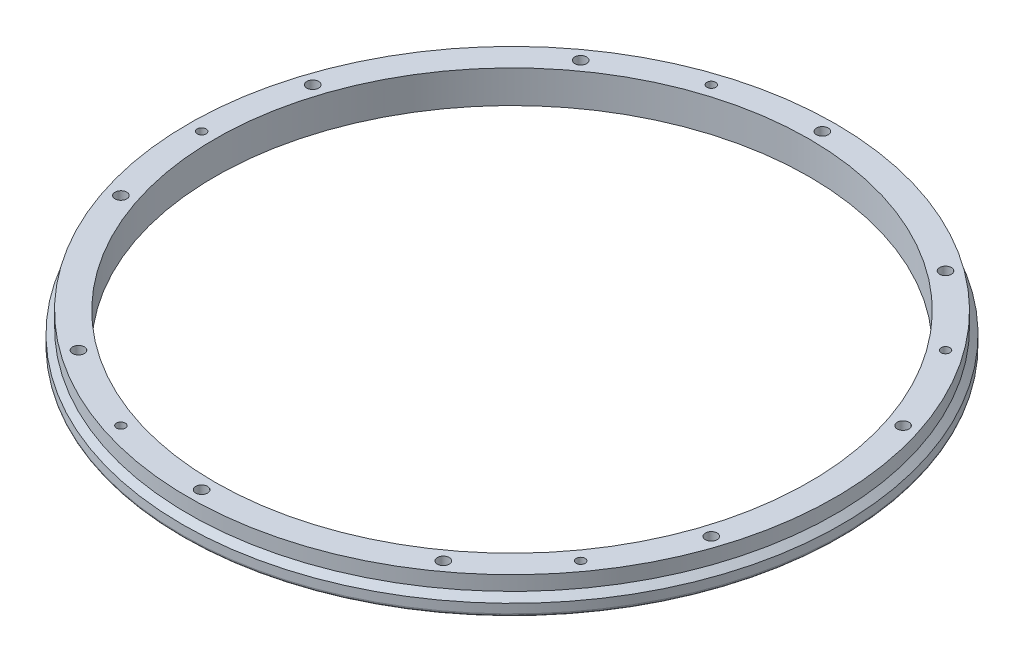
ISO-10303-21;
HEADER;
FILE_DESCRIPTION(('STEP AP214'),'2;1');
FILE_NAME('part.step','',(''),(''),'','','');
FILE_SCHEMA(('AUTOMOTIVE_DESIGN { 1 0 10303 214 1 1 1 1 }'));
ENDSEC;
DATA;
#1=APPLICATION_CONTEXT('core data for automotive mechanical design processes');
#2=APPLICATION_PROTOCOL_DEFINITION('international standard','automotive_design',2000,#1);
#3=PRODUCT_CONTEXT('',#1,'mechanical');
#4=PRODUCT('Part','Part','',(#3));
#5=PRODUCT_RELATED_PRODUCT_CATEGORY('part','',(#4));
#6=PRODUCT_DEFINITION_FORMATION('','',#4);
#7=PRODUCT_DEFINITION_CONTEXT('part definition',#1,'design');
#8=PRODUCT_DEFINITION('design','',#6,#7);
#9=PRODUCT_DEFINITION_SHAPE('','',#8);
#10=(LENGTH_UNIT() NAMED_UNIT(*) SI_UNIT(.MILLI.,.METRE.));
#11=(NAMED_UNIT(*) PLANE_ANGLE_UNIT() SI_UNIT($,.RADIAN.));
#12=(NAMED_UNIT(*) SI_UNIT($,.STERADIAN.) SOLID_ANGLE_UNIT());
#13=UNCERTAINTY_MEASURE_WITH_UNIT(LENGTH_MEASURE(1.E-05),#10,'distance_accuracy_value','');
#14=(GEOMETRIC_REPRESENTATION_CONTEXT(3) GLOBAL_UNCERTAINTY_ASSIGNED_CONTEXT((#13)) GLOBAL_UNIT_ASSIGNED_CONTEXT((#10,
#11,#12)) REPRESENTATION_CONTEXT('',''));
#15=CARTESIAN_POINT('',(0.,0.,0.));
#16=DIRECTION('',(0.,0.,1.));
#17=DIRECTION('',(1.,0.,0.));
#18=AXIS2_PLACEMENT_3D('',#15,#16,#17);
#19=CARTESIAN_POINT('',(-32.5935674816987,-27.9999999999878,100.312686056231));
#20=DIRECTION('',(0.,1.,0.));
#21=DIRECTION('',(0.,0.,1.));
#22=AXIS2_PLACEMENT_3D('',#19,#20,#21);
#23=CYLINDRICAL_SURFACE('',#22,1.49999999999999);
#24=CARTESIAN_POINT('',(-32.5935674816987,-16.9245689014202,100.312686056231));
#25=DIRECTION('',(0.,1.,0.));
#26=DIRECTION('',(0.,0.,1.));
#27=AXIS2_PLACEMENT_3D('',#24,#25,#26);
#28=CIRCLE('',#27,1.49999999999999);
#29=CARTESIAN_POINT('',(-32.5935674816987,-16.9245689014202,101.812686056231));
#30=VERTEX_POINT('',#29);
#31=EDGE_CURVE('E83',#30,#30,#28,.T.);
#32=ORIENTED_EDGE('',*,*,#31,.T.);
#33=EDGE_LOOP('',(#32));
#34=FACE_BOUND('',#33,.T.);
#35=CARTESIAN_POINT('',(-32.5935674816987,-21.5999999999878,100.312686056231));
#36=DIRECTION('',(0.,-1.,0.));
#37=DIRECTION('',(0.,0.,-1.));
#38=AXIS2_PLACEMENT_3D('',#35,#36,#37);
#39=CIRCLE('',#38,1.49999999999999);
#40=CARTESIAN_POINT('',(-32.5935674816987,-21.5999999999878,98.8126860562309));
#41=VERTEX_POINT('',#40);
#42=EDGE_CURVE('E49',#41,#41,#39,.F.);
#43=ORIENTED_EDGE('',*,*,#42,.F.);
#44=EDGE_LOOP('',(#43));
#45=FACE_BOUND('',#44,.T.);
#46=ADVANCED_FACE('F45',(#34,#45),#23,.F.);
#47=CARTESIAN_POINT('',(85.331067481697,-27.9999999999878,61.9966494855494));
#48=DIRECTION('',(0.,1.,0.));
#49=DIRECTION('',(0.,0.,1.));
#50=AXIS2_PLACEMENT_3D('',#47,#48,#49);
#51=CYLINDRICAL_SURFACE('',#50,1.49999999999999);
#52=CARTESIAN_POINT('',(85.331067481697,-16.9245689014202,61.9966494855494));
#53=DIRECTION('',(0.,1.,0.));
#54=DIRECTION('',(0.,0.,1.));
#55=AXIS2_PLACEMENT_3D('',#52,#53,#54);
#56=CIRCLE('',#55,1.49999999999999);
#57=CARTESIAN_POINT('',(85.331067481697,-16.9245689014202,63.4966494855493));
#58=VERTEX_POINT('',#57);
#59=EDGE_CURVE('E88',#58,#58,#56,.T.);
#60=ORIENTED_EDGE('',*,*,#59,.T.);
#61=EDGE_LOOP('',(#60));
#62=FACE_BOUND('',#61,.T.);
#63=CARTESIAN_POINT('',(85.331067481697,-21.5999999999878,61.9966494855494));
#64=DIRECTION('',(0.,-1.,0.));
#65=DIRECTION('',(0.,0.,-1.));
#66=AXIS2_PLACEMENT_3D('',#63,#64,#65);
#67=CIRCLE('',#66,1.49999999999999);
#68=CARTESIAN_POINT('',(85.331067481697,-21.5999999999878,60.4966494855494));
#69=VERTEX_POINT('',#68);
#70=EDGE_CURVE('E76',#69,#69,#67,.F.);
#71=ORIENTED_EDGE('',*,*,#70,.F.);
#72=EDGE_LOOP('',(#71));
#73=FACE_BOUND('',#72,.T.);
#74=ADVANCED_FACE('F216',(#62,#73),#51,.F.);
#75=CARTESIAN_POINT('',(85.3310674816979,-27.9999999999878,-61.9966494855481));
#76=DIRECTION('',(0.,1.,0.));
#77=DIRECTION('',(0.,0.,1.));
#78=AXIS2_PLACEMENT_3D('',#75,#76,#77);
#79=CYLINDRICAL_SURFACE('',#78,1.5);
#80=CARTESIAN_POINT('',(85.3310674816979,-16.9245689014202,-61.9966494855481));
#81=DIRECTION('',(0.,1.,0.));
#82=DIRECTION('',(0.,0.,1.));
#83=AXIS2_PLACEMENT_3D('',#80,#81,#82);
#84=CIRCLE('',#83,1.5);
#85=CARTESIAN_POINT('',(85.3310674816979,-16.9245689014202,-60.4966494855481));
#86=VERTEX_POINT('',#85);
#87=EDGE_CURVE('E94',#86,#86,#84,.T.);
#88=ORIENTED_EDGE('',*,*,#87,.T.);
#89=EDGE_LOOP('',(#88));
#90=FACE_BOUND('',#89,.T.);
#91=CARTESIAN_POINT('',(85.3310674816979,-21.5999999999878,-61.9966494855481));
#92=DIRECTION('',(0.,-1.,0.));
#93=DIRECTION('',(0.,0.,-1.));
#94=AXIS2_PLACEMENT_3D('',#91,#92,#93);
#95=CIRCLE('',#94,1.5);
#96=CARTESIAN_POINT('',(85.3310674816979,-21.5999999999878,-63.4966494855481));
#97=VERTEX_POINT('',#96);
#98=EDGE_CURVE('E73',#97,#97,#95,.F.);
#99=ORIENTED_EDGE('',*,*,#98,.F.);
#100=EDGE_LOOP('',(#99));
#101=FACE_BOUND('',#100,.T.);
#102=ADVANCED_FACE('F221',(#90,#101),#79,.F.);
#103=CARTESIAN_POINT('',(-32.5935674816973,-27.9999999999878,-100.312686056231));
#104=DIRECTION('',(0.,1.,0.));
#105=DIRECTION('',(0.,0.,1.));
#106=AXIS2_PLACEMENT_3D('',#103,#104,#105);
#107=CYLINDRICAL_SURFACE('',#106,1.49999999999999);
#108=CARTESIAN_POINT('',(-32.5935674816973,-16.9245689014202,-100.312686056231));
#109=DIRECTION('',(0.,1.,0.));
#110=DIRECTION('',(0.,0.,1.));
#111=AXIS2_PLACEMENT_3D('',#108,#109,#110);
#112=CIRCLE('',#111,1.49999999999999);
#113=CARTESIAN_POINT('',(-32.5935674816973,-16.9245689014202,-98.8126860562314));
#114=VERTEX_POINT('',#113);
#115=EDGE_CURVE('E707',#114,#114,#112,.T.);
#116=ORIENTED_EDGE('',*,*,#115,.T.);
#117=EDGE_LOOP('',(#116));
#118=FACE_BOUND('',#117,.T.);
#119=CARTESIAN_POINT('',(-32.5935674816973,-21.5999999999878,-100.312686056231));
#120=DIRECTION('',(0.,-1.,0.));
#121=DIRECTION('',(0.,0.,-1.));
#122=AXIS2_PLACEMENT_3D('',#119,#120,#121);
#123=CIRCLE('',#122,1.49999999999999);
#124=CARTESIAN_POINT('',(-32.5935674816973,-21.5999999999878,-101.812686056231));
#125=VERTEX_POINT('',#124);
#126=EDGE_CURVE('E68',#125,#125,#123,.F.);
#127=ORIENTED_EDGE('',*,*,#126,.F.);
#128=EDGE_LOOP('',(#127));
#129=FACE_BOUND('',#128,.T.);
#130=ADVANCED_FACE('F555',(#118,#129),#107,.F.);
#131=CARTESIAN_POINT('',(-105.475,-27.9999999999878,0.));
#132=DIRECTION('',(0.,1.,0.));
#133=DIRECTION('',(0.,0.,1.));
#134=AXIS2_PLACEMENT_3D('',#131,#132,#133);
#135=CYLINDRICAL_SURFACE('',#134,1.5);
#136=CARTESIAN_POINT('',(-105.475,-16.9245689014202,0.));
#137=DIRECTION('',(0.,1.,0.));
#138=DIRECTION('',(0.,0.,1.));
#139=AXIS2_PLACEMENT_3D('',#136,#137,#138);
#140=CIRCLE('',#139,1.5);
#141=CARTESIAN_POINT('',(-105.475,-16.9245689014202,1.5));
#142=VERTEX_POINT('',#141);
#143=EDGE_CURVE('E117',#142,#142,#140,.T.);
#144=ORIENTED_EDGE('',*,*,#143,.T.);
#145=EDGE_LOOP('',(#144));
#146=FACE_BOUND('',#145,.T.);
#147=CARTESIAN_POINT('',(-105.475,-21.5999999999878,0.));
#148=DIRECTION('',(0.,-1.,0.));
#149=DIRECTION('',(0.,0.,-1.));
#150=AXIS2_PLACEMENT_3D('',#147,#148,#149);
#151=CIRCLE('',#150,1.5);
#152=CARTESIAN_POINT('',(-105.475,-21.5999999999878,-1.5));
#153=VERTEX_POINT('',#152);
#154=EDGE_CURVE('E64',#153,#153,#151,.F.);
#155=ORIENTED_EDGE('',*,*,#154,.F.);
#156=EDGE_LOOP('',(#155));
#157=FACE_BOUND('',#156,.T.);
#158=ADVANCED_FACE('F213',(#146,#157),#135,.F.);
#159=CARTESIAN_POINT('',(0.,0.,0.));
#160=DIRECTION('',(0.,-1.,0.));
#161=DIRECTION('',(0.,0.,-1.));
#162=AXIS2_PLACEMENT_3D('',#159,#160,#161);
#163=CYLINDRICAL_SURFACE('',#162,112.);
#164=CARTESIAN_POINT('',(0.,-26.9999999999877,0.));
#165=DIRECTION('',(0.,-1.,0.));
#166=DIRECTION('',(0.,0.,-1.));
#167=AXIS2_PLACEMENT_3D('',#164,#165,#166);
#168=CIRCLE('',#167,112.);
#169=CARTESIAN_POINT('',(0.,-26.9999999999877,-112.));
#170=VERTEX_POINT('',#169);
#171=EDGE_CURVE('E10',#170,#170,#168,.T.);
#172=ORIENTED_EDGE('',*,*,#171,.F.);
#173=EDGE_LOOP('',(#172));
#174=FACE_BOUND('',#173,.T.);
#175=CARTESIAN_POINT('',(0.,-23.8991378028648,0.));
#176=DIRECTION('',(0.,-1.,0.));
#177=DIRECTION('',(0.,0.,-1.));
#178=AXIS2_PLACEMENT_3D('',#175,#176,#177);
#179=CIRCLE('',#178,112.);
#180=CARTESIAN_POINT('',(0.,-23.8991378028648,-112.));
#181=VERTEX_POINT('',#180);
#182=EDGE_CURVE('E102',#181,#181,#179,.T.);
#183=ORIENTED_EDGE('',*,*,#182,.T.);
#184=EDGE_LOOP('',(#183));
#185=FACE_BOUND('',#184,.T.);
#186=ADVANCED_FACE('F47',(#174,#185),#163,.T.);
#187=CARTESIAN_POINT('',(0.,-26.9999999999878,0.));
#188=DIRECTION('',(0.,-1.,0.));
#189=DIRECTION('',(0.,0.,-1.));
#190=AXIS2_PLACEMENT_3D('',#187,#188,#189);
#191=TOROIDAL_SURFACE('',#190,111.,1.);
#192=CARTESIAN_POINT('',(0.,-27.9999999999878,0.));
#193=DIRECTION('',(0.,-1.,0.));
#194=DIRECTION('',(0.,0.,-1.));
#195=AXIS2_PLACEMENT_3D('',#192,#193,#194);
#196=CIRCLE('',#195,111.);
#197=CARTESIAN_POINT('',(0.,-27.9999999999878,-111.));
#198=VERTEX_POINT('',#197);
#199=EDGE_CURVE('E54',#198,#198,#196,.T.);
#200=ORIENTED_EDGE('',*,*,#199,.F.);
#201=EDGE_LOOP('',(#200));
#202=FACE_BOUND('',#201,.T.);
#203=ORIENTED_EDGE('',*,*,#171,.T.);
#204=EDGE_LOOP('',(#203));
#205=FACE_BOUND('',#204,.T.);
#206=ADVANCED_FACE('F204',(#202,#205),#191,.T.);
#207=CARTESIAN_POINT('',(0.,-27.9999999999878,0.));
#208=DIRECTION('',(0.,1.,0.));
#209=DIRECTION('',(0.,0.,1.));
#210=AXIS2_PLACEMENT_3D('',#207,#208,#209);
#211=PLANE('',#210);
#212=CARTESIAN_POINT('',(-105.475,-27.9999999999878,0.));
#213=DIRECTION('',(0.,-1.,0.));
#214=DIRECTION('',(0.,0.,-1.));
#215=AXIS2_PLACEMENT_3D('',#212,#213,#214);
#216=CIRCLE('',#215,3.50000000000001);
#217=CARTESIAN_POINT('',(-105.475,-27.9999999999878,-3.50000000000001));
#218=VERTEX_POINT('',#217);
#219=EDGE_CURVE('E791',#218,#218,#216,.T.);
#220=ORIENTED_EDGE('',*,*,#219,.F.);
#221=EDGE_LOOP('',(#220));
#222=FACE_BOUND('',#221,.T.);
#223=CARTESIAN_POINT('',(-32.5935674816973,-27.9999999999878,100.312686056231));
#224=DIRECTION('',(0.,-1.,0.));
#225=DIRECTION('',(0.,0.,-1.));
#226=AXIS2_PLACEMENT_3D('',#223,#224,#225);
#227=CIRCLE('',#226,3.50000000000001);
#228=CARTESIAN_POINT('',(-32.5935674816973,-27.9999999999878,96.8126860562314));
#229=VERTEX_POINT('',#228);
#230=EDGE_CURVE('E787',#229,#229,#227,.T.);
#231=ORIENTED_EDGE('',*,*,#230,.F.);
#232=EDGE_LOOP('',(#231));
#233=FACE_BOUND('',#232,.T.);
#234=CARTESIAN_POINT('',(85.3310674816979,-27.9999999999878,61.9966494855481));
#235=DIRECTION('',(0.,-1.,0.));
#236=DIRECTION('',(0.,0.,-1.));
#237=AXIS2_PLACEMENT_3D('',#234,#235,#236);
#238=CIRCLE('',#237,3.5);
#239=CARTESIAN_POINT('',(85.3310674816979,-27.9999999999878,58.4966494855481));
#240=VERTEX_POINT('',#239);
#241=EDGE_CURVE('E779',#240,#240,#238,.T.);
#242=ORIENTED_EDGE('',*,*,#241,.F.);
#243=EDGE_LOOP('',(#242));
#244=FACE_BOUND('',#243,.T.);
#245=CARTESIAN_POINT('',(85.331067481697,-27.9999999999878,-61.9966494855494));
#246=DIRECTION('',(0.,-1.,0.));
#247=DIRECTION('',(0.,0.,-1.));
#248=AXIS2_PLACEMENT_3D('',#245,#246,#247);
#249=CIRCLE('',#248,3.50000000000001);
#250=CARTESIAN_POINT('',(85.331067481697,-27.9999999999878,-65.4966494855494));
#251=VERTEX_POINT('',#250);
#252=EDGE_CURVE('E771',#251,#251,#249,.T.);
#253=ORIENTED_EDGE('',*,*,#252,.F.);
#254=EDGE_LOOP('',(#253));
#255=FACE_BOUND('',#254,.T.);
#256=CARTESIAN_POINT('',(-32.5935674816987,-27.9999999999878,-100.312686056231));
#257=DIRECTION('',(0.,-1.,0.));
#258=DIRECTION('',(0.,0.,-1.));
#259=AXIS2_PLACEMENT_3D('',#256,#257,#258);
#260=CIRCLE('',#259,3.5);
#261=CARTESIAN_POINT('',(-32.5935674816987,-27.9999999999878,-103.812686056231));
#262=VERTEX_POINT('',#261);
#263=EDGE_CURVE('E763',#262,#262,#260,.T.);
#264=ORIENTED_EDGE('',*,*,#263,.F.);
#265=EDGE_LOOP('',(#264));
#266=FACE_BOUND('',#265,.T.);
#267=CARTESIAN_POINT('',(0.,-27.9999999999878,0.));
#268=DIRECTION('',(0.,-1.,0.));
#269=DIRECTION('',(0.,0.,-1.));
#270=AXIS2_PLACEMENT_3D('',#267,#268,#269);
#271=CIRCLE('',#270,101.);
#272=CARTESIAN_POINT('',(0.,-27.9999999999878,-101.));
#273=VERTEX_POINT('',#272);
#274=EDGE_CURVE('E60',#273,#273,#271,.T.);
#275=ORIENTED_EDGE('',*,*,#274,.F.);
#276=EDGE_LOOP('',(#275));
#277=FACE_BOUND('',#276,.T.);
#278=ORIENTED_EDGE('',*,*,#199,.T.);
#279=EDGE_LOOP('',(#278));
#280=FACE_BOUND('',#279,.T.);
#281=ADVANCED_FACE('F201',(#222,#233,#244,#255,#266,#277,#280),#211,.F.);
#282=CARTESIAN_POINT('',(0.,0.,0.));
#283=DIRECTION('',(0.,-1.,0.));
#284=DIRECTION('',(0.,0.,-1.));
#285=AXIS2_PLACEMENT_3D('',#282,#283,#284);
#286=CYLINDRICAL_SURFACE('',#285,101.);
#287=ORIENTED_EDGE('',*,*,#274,.T.);
#288=EDGE_LOOP('',(#287));
#289=FACE_BOUND('',#288,.T.);
#290=CARTESIAN_POINT('',(0.,-16.9245689014202,0.));
#291=DIRECTION('',(0.,-1.,0.));
#292=DIRECTION('',(0.,0.,-1.));
#293=AXIS2_PLACEMENT_3D('',#290,#291,#292);
#294=CIRCLE('',#293,101.);
#295=CARTESIAN_POINT('',(0.,-16.9245689014202,-101.));
#296=VERTEX_POINT('',#295);
#297=EDGE_CURVE('E191',#296,#296,#294,.T.);
#298=ORIENTED_EDGE('',*,*,#297,.F.);
#299=EDGE_LOOP('',(#298));
#300=FACE_BOUND('',#299,.T.);
#301=ADVANCED_FACE('F198',(#289,#300),#286,.F.);
#302=CARTESIAN_POINT('',(0.,-16.9245689014202,0.));
#303=DIRECTION('',(0.,-1.,0.));
#304=DIRECTION('',(0.,0.,-1.));
#305=AXIS2_PLACEMENT_3D('',#302,#303,#304);
#306=PLANE('',#305);
#307=ORIENTED_EDGE('',*,*,#143,.F.);
#308=EDGE_LOOP('',(#307));
#309=FACE_BOUND('',#308,.T.);
#310=ORIENTED_EDGE('',*,*,#115,.F.);
#311=EDGE_LOOP('',(#310));
#312=FACE_BOUND('',#311,.T.);
#313=ORIENTED_EDGE('',*,*,#87,.F.);
#314=EDGE_LOOP('',(#313));
#315=FACE_BOUND('',#314,.T.);
#316=ORIENTED_EDGE('',*,*,#59,.F.);
#317=EDGE_LOOP('',(#316));
#318=FACE_BOUND('',#317,.T.);
#319=ORIENTED_EDGE('',*,*,#31,.F.);
#320=EDGE_LOOP('',(#319));
#321=FACE_BOUND('',#320,.T.);
#322=CARTESIAN_POINT('',(0.,-16.9245689014202,-105.475));
#323=DIRECTION('',(0.,1.,0.));
#324=DIRECTION('',(0.,0.,1.));
#325=AXIS2_PLACEMENT_3D('',#322,#323,#324);
#326=CIRCLE('',#325,2.);
#327=CARTESIAN_POINT('',(0.,-16.9245689014202,-103.475));
#328=VERTEX_POINT('',#327);
#329=EDGE_CURVE('E103',#328,#328,#326,.T.);
#330=ORIENTED_EDGE('',*,*,#329,.F.);
#331=EDGE_LOOP('',(#330));
#332=FACE_BOUND('',#331,.T.);
#333=CARTESIAN_POINT('',(-61.9966494855463,-16.9245689014202,-85.3310674816905));
#334=DIRECTION('',(0.,1.,0.));
#335=DIRECTION('',(0.,0.,1.));
#336=AXIS2_PLACEMENT_3D('',#333,#334,#335);
#337=CIRCLE('',#336,2.0000000000056);
#338=CARTESIAN_POINT('',(-61.9966494855463,-16.9245689014202,-83.331067481685));
#339=VERTEX_POINT('',#338);
#340=EDGE_CURVE('E108',#339,#339,#337,.T.);
#341=ORIENTED_EDGE('',*,*,#340,.F.);
#342=EDGE_LOOP('',(#341));
#343=FACE_BOUND('',#342,.T.);
#344=CARTESIAN_POINT('',(-100.312686056223,-16.9245689014202,-32.5935674816862));
#345=DIRECTION('',(0.,1.,0.));
#346=DIRECTION('',(0.,0.,1.));
#347=AXIS2_PLACEMENT_3D('',#344,#345,#346);
#348=CIRCLE('',#347,2.00000000001241);
#349=CARTESIAN_POINT('',(-100.312686056223,-16.9245689014202,-30.5935674816738));
#350=VERTEX_POINT('',#349);
#351=EDGE_CURVE('E173',#350,#350,#348,.T.);
#352=ORIENTED_EDGE('',*,*,#351,.F.);
#353=EDGE_LOOP('',(#352));
#354=FACE_BOUND('',#353,.T.);
#355=CARTESIAN_POINT('',(-100.312686056216,-16.9245689014202,32.593567481709));
#356=DIRECTION('',(0.,1.,0.));
#357=DIRECTION('',(0.,0.,1.));
#358=AXIS2_PLACEMENT_3D('',#355,#356,#357);
#359=CIRCLE('',#358,2.0000000000193);
#360=CARTESIAN_POINT('',(-100.312686056216,-16.9245689014202,34.5935674817283));
#361=VERTEX_POINT('',#360);
#362=EDGE_CURVE('E165',#361,#361,#359,.T.);
#363=ORIENTED_EDGE('',*,*,#362,.F.);
#364=EDGE_LOOP('',(#363));
#365=FACE_BOUND('',#364,.T.);
#366=CARTESIAN_POINT('',(-61.996649485527,-16.9245689014202,85.3310674817046));
#367=DIRECTION('',(0.,1.,0.));
#368=DIRECTION('',(0.,0.,1.));
#369=AXIS2_PLACEMENT_3D('',#366,#367,#368);
#370=CIRCLE('',#369,2.00000000002363);
#371=CARTESIAN_POINT('',(-61.996649485527,-16.9245689014202,87.3310674817283));
#372=VERTEX_POINT('',#371);
#373=EDGE_CURVE('E157',#372,#372,#370,.T.);
#374=ORIENTED_EDGE('',*,*,#373,.F.);
#375=EDGE_LOOP('',(#374));
#376=FACE_BOUND('',#375,.T.);
#377=CARTESIAN_POINT('',(2.39429395015903E-11,-16.9245689014202,105.475));
#378=DIRECTION('',(0.,1.,0.));
#379=DIRECTION('',(0.,0.,1.));
#380=AXIS2_PLACEMENT_3D('',#377,#378,#379);
#381=CIRCLE('',#380,2.0000000000236);
#382=CARTESIAN_POINT('',(2.39429395015903E-11,-16.9245689014202,107.475000000024));
#383=VERTEX_POINT('',#382);
#384=EDGE_CURVE('E149',#383,#383,#381,.T.);
#385=ORIENTED_EDGE('',*,*,#384,.F.);
#386=EDGE_LOOP('',(#385));
#387=FACE_BOUND('',#386,.T.);
#388=CARTESIAN_POINT('',(61.9966494855703,-16.9245689014202,85.3310674816905));
#389=DIRECTION('',(0.,1.,0.));
#390=DIRECTION('',(0.,0.,1.));
#391=AXIS2_PLACEMENT_3D('',#388,#389,#390);
#392=CIRCLE('',#391,2.00000000001924);
#393=CARTESIAN_POINT('',(61.9966494855703,-16.9245689014202,87.3310674817098));
#394=VERTEX_POINT('',#393);
#395=EDGE_CURVE('E141',#394,#394,#392,.T.);
#396=ORIENTED_EDGE('',*,*,#395,.F.);
#397=EDGE_LOOP('',(#396));
#398=FACE_BOUND('',#397,.T.);
#399=CARTESIAN_POINT('',(100.312686056247,-16.9245689014202,32.5935674816862));
#400=DIRECTION('',(0.,1.,0.));
#401=DIRECTION('',(0.,0.,1.));
#402=AXIS2_PLACEMENT_3D('',#399,#400,#401);
#403=CIRCLE('',#402,2.00000000001209);
#404=CARTESIAN_POINT('',(100.312686056247,-16.9245689014202,34.5935674816983));
#405=VERTEX_POINT('',#404);
#406=EDGE_CURVE('E133',#405,#405,#403,.T.);
#407=ORIENTED_EDGE('',*,*,#406,.F.);
#408=EDGE_LOOP('',(#407));
#409=FACE_BOUND('',#408,.T.);
#410=CARTESIAN_POINT('',(100.31268605624,-16.9245689014202,-32.593567481709));
#411=DIRECTION('',(0.,1.,0.));
#412=DIRECTION('',(0.,0.,1.));
#413=AXIS2_PLACEMENT_3D('',#410,#411,#412);
#414=CIRCLE('',#413,2.00000000000487);
#415=CARTESIAN_POINT('',(100.31268605624,-16.9245689014202,-30.5935674817041));
#416=VERTEX_POINT('',#415);
#417=EDGE_CURVE('E125',#416,#416,#414,.T.);
#418=ORIENTED_EDGE('',*,*,#417,.F.);
#419=EDGE_LOOP('',(#418));
#420=FACE_BOUND('',#419,.T.);
#421=CARTESIAN_POINT('',(61.9966494855509,-16.9245689014202,-85.3310674817046));
#422=DIRECTION('',(0.,1.,0.));
#423=DIRECTION('',(0.,0.,1.));
#424=AXIS2_PLACEMENT_3D('',#421,#422,#423);
#425=CIRCLE('',#424,2.00000000000026);
#426=CARTESIAN_POINT('',(61.9966494855509,-16.9245689014202,-83.3310674817044));
#427=VERTEX_POINT('',#426);
#428=EDGE_CURVE('E107',#427,#427,#425,.T.);
#429=ORIENTED_EDGE('',*,*,#428,.F.);
#430=EDGE_LOOP('',(#429));
#431=FACE_BOUND('',#430,.T.);
#432=CARTESIAN_POINT('',(0.,-16.9245689014202,0.));
#433=DIRECTION('',(0.,-1.,0.));
#434=DIRECTION('',(0.,0.,-1.));
#435=AXIS2_PLACEMENT_3D('',#432,#433,#434);
#436=CIRCLE('',#435,109.95);
#437=CARTESIAN_POINT('',(0.,-16.9245689014202,-109.95));
#438=VERTEX_POINT('',#437);
#439=EDGE_CURVE('E187',#438,#438,#436,.T.);
#440=ORIENTED_EDGE('',*,*,#439,.F.);
#441=EDGE_LOOP('',(#440));
#442=FACE_BOUND('',#441,.T.);
#443=ORIENTED_EDGE('',*,*,#297,.T.);
#444=EDGE_LOOP('',(#443));
#445=FACE_BOUND('',#444,.T.);
#446=ADVANCED_FACE('F315',(#309,#312,#315,#318,#321,#332,#343,#354,#365,#376,#387,#398,#409,
#420,#431,#442,#445),#306,.F.);
#447=CARTESIAN_POINT('',(0.,0.,0.));
#448=DIRECTION('',(0.,-1.,0.));
#449=DIRECTION('',(0.,0.,-1.));
#450=AXIS2_PLACEMENT_3D('',#447,#448,#449);
#451=CYLINDRICAL_SURFACE('',#450,109.95);
#452=CARTESIAN_POINT('',(0.,-21.8491378028649,0.));
#453=DIRECTION('',(0.,-1.,0.));
#454=DIRECTION('',(0.,0.,-1.));
#455=AXIS2_PLACEMENT_3D('',#452,#453,#454);
#456=CIRCLE('',#455,109.95);
#457=CARTESIAN_POINT('',(0.,-21.8491378028649,-109.95));
#458=VERTEX_POINT('',#457);
#459=EDGE_CURVE('E183',#458,#458,#456,.T.);
#460=ORIENTED_EDGE('',*,*,#459,.F.);
#461=EDGE_LOOP('',(#460));
#462=FACE_BOUND('',#461,.T.);
#463=ORIENTED_EDGE('',*,*,#439,.T.);
#464=EDGE_LOOP('',(#463));
#465=FACE_BOUND('',#464,.T.);
#466=ADVANCED_FACE('F311',(#462,#465),#451,.T.);
#467=CARTESIAN_POINT('',(0.,-21.8491378028649,0.));
#468=DIRECTION('',(0.,-1.,0.));
#469=DIRECTION('',(0.,0.,-1.));
#470=AXIS2_PLACEMENT_3D('',#467,#468,#469);
#471=CONICAL_SURFACE('',#470,109.95,0.785398163397452);
#472=ORIENTED_EDGE('',*,*,#182,.F.);
#473=EDGE_LOOP('',(#472));
#474=FACE_BOUND('',#473,.T.);
#475=ORIENTED_EDGE('',*,*,#459,.T.);
#476=EDGE_LOOP('',(#475));
#477=FACE_BOUND('',#476,.T.);
#478=ADVANCED_FACE('F249',(#474,#477),#471,.T.);
#479=CARTESIAN_POINT('',(61.9966494855509,-22.9245689014202,-85.3310674817046));
#480=DIRECTION('',(0.,1.,0.));
#481=DIRECTION('',(0.,0.,1.));
#482=AXIS2_PLACEMENT_3D('',#479,#480,#481);
#483=CYLINDRICAL_SURFACE('',#482,2.00000000000026);
#484=CARTESIAN_POINT('',(61.9966494855509,-22.9245689014202,-85.3310674817046));
#485=DIRECTION('',(0.,1.,0.));
#486=DIRECTION('',(0.,0.,1.));
#487=AXIS2_PLACEMENT_3D('',#484,#485,#486);
#488=CIRCLE('',#487,2.00000000000026);
#489=CARTESIAN_POINT('',(61.9966494855509,-22.9245689014202,-83.3310674817044));
#490=VERTEX_POINT('',#489);
#491=EDGE_CURVE('E121',#490,#490,#488,.T.);
#492=ORIENTED_EDGE('',*,*,#491,.F.);
#493=EDGE_LOOP('',(#492));
#494=FACE_BOUND('',#493,.T.);
#495=ORIENTED_EDGE('',*,*,#428,.T.);
#496=EDGE_LOOP('',(#495));
#497=FACE_BOUND('',#496,.T.);
#498=ADVANCED_FACE('F245',(#494,#497),#483,.F.);
#499=CARTESIAN_POINT('',(61.9966494855509,-22.9245689014202,-85.3310674817046));
#500=DIRECTION('',(0.,1.,0.));
#501=DIRECTION('',(0.,0.,1.));
#502=AXIS2_PLACEMENT_3D('',#499,#500,#501);
#503=PLANE('',#502);
#504=ORIENTED_EDGE('',*,*,#491,.T.);
#505=EDGE_LOOP('',(#504));
#506=FACE_BOUND('',#505,.T.);
#507=ADVANCED_FACE('F248',(#506),#503,.T.);
#508=CARTESIAN_POINT('',(100.31268605624,-22.9245689014202,-32.593567481709));
#509=DIRECTION('',(0.,1.,0.));
#510=DIRECTION('',(0.,0.,1.));
#511=AXIS2_PLACEMENT_3D('',#508,#509,#510);
#512=CYLINDRICAL_SURFACE('',#511,2.00000000000487);
#513=CARTESIAN_POINT('',(100.31268605624,-22.9245689014202,-32.593567481709));
#514=DIRECTION('',(0.,1.,0.));
#515=DIRECTION('',(0.,0.,1.));
#516=AXIS2_PLACEMENT_3D('',#513,#514,#515);
#517=CIRCLE('',#516,2.00000000000487);
#518=CARTESIAN_POINT('',(100.31268605624,-22.9245689014202,-30.5935674817041));
#519=VERTEX_POINT('',#518);
#520=EDGE_CURVE('E129',#519,#519,#517,.T.);
#521=ORIENTED_EDGE('',*,*,#520,.F.);
#522=EDGE_LOOP('',(#521));
#523=FACE_BOUND('',#522,.T.);
#524=ORIENTED_EDGE('',*,*,#417,.T.);
#525=EDGE_LOOP('',(#524));
#526=FACE_BOUND('',#525,.T.);
#527=ADVANCED_FACE('F253',(#523,#526),#512,.F.);
#528=CARTESIAN_POINT('',(100.31268605624,-22.9245689014202,-32.593567481709));
#529=DIRECTION('',(0.,1.,0.));
#530=DIRECTION('',(0.,0.,1.));
#531=AXIS2_PLACEMENT_3D('',#528,#529,#530);
#532=PLANE('',#531);
#533=ORIENTED_EDGE('',*,*,#520,.T.);
#534=EDGE_LOOP('',(#533));
#535=FACE_BOUND('',#534,.T.);
#536=ADVANCED_FACE('F257',(#535),#532,.T.);
#537=CARTESIAN_POINT('',(100.312686056247,-22.9245689014202,32.5935674816862));
#538=DIRECTION('',(0.,1.,0.));
#539=DIRECTION('',(0.,0.,1.));
#540=AXIS2_PLACEMENT_3D('',#537,#538,#539);
#541=CYLINDRICAL_SURFACE('',#540,2.00000000001209);
#542=CARTESIAN_POINT('',(100.312686056247,-22.9245689014202,32.5935674816862));
#543=DIRECTION('',(0.,1.,0.));
#544=DIRECTION('',(0.,0.,1.));
#545=AXIS2_PLACEMENT_3D('',#542,#543,#544);
#546=CIRCLE('',#545,2.00000000001209);
#547=CARTESIAN_POINT('',(100.312686056247,-22.9245689014202,34.5935674816983));
#548=VERTEX_POINT('',#547);
#549=EDGE_CURVE('E137',#548,#548,#546,.T.);
#550=ORIENTED_EDGE('',*,*,#549,.F.);
#551=EDGE_LOOP('',(#550));
#552=FACE_BOUND('',#551,.T.);
#553=ORIENTED_EDGE('',*,*,#406,.T.);
#554=EDGE_LOOP('',(#553));
#555=FACE_BOUND('',#554,.T.);
#556=ADVANCED_FACE('F261',(#552,#555),#541,.F.);
#557=CARTESIAN_POINT('',(100.312686056247,-22.9245689014202,32.5935674816862));
#558=DIRECTION('',(0.,1.,0.));
#559=DIRECTION('',(0.,0.,1.));
#560=AXIS2_PLACEMENT_3D('',#557,#558,#559);
#561=PLANE('',#560);
#562=ORIENTED_EDGE('',*,*,#549,.T.);
#563=EDGE_LOOP('',(#562));
#564=FACE_BOUND('',#563,.T.);
#565=ADVANCED_FACE('F265',(#564),#561,.T.);
#566=CARTESIAN_POINT('',(61.9966494855703,-22.9245689014202,85.3310674816905));
#567=DIRECTION('',(0.,1.,0.));
#568=DIRECTION('',(0.,0.,1.));
#569=AXIS2_PLACEMENT_3D('',#566,#567,#568);
#570=CYLINDRICAL_SURFACE('',#569,2.00000000001924);
#571=CARTESIAN_POINT('',(61.9966494855703,-22.9245689014202,85.3310674816905));
#572=DIRECTION('',(0.,1.,0.));
#573=DIRECTION('',(0.,0.,1.));
#574=AXIS2_PLACEMENT_3D('',#571,#572,#573);
#575=CIRCLE('',#574,2.00000000001924);
#576=CARTESIAN_POINT('',(61.9966494855703,-22.9245689014202,87.3310674817098));
#577=VERTEX_POINT('',#576);
#578=EDGE_CURVE('E145',#577,#577,#575,.T.);
#579=ORIENTED_EDGE('',*,*,#578,.F.);
#580=EDGE_LOOP('',(#579));
#581=FACE_BOUND('',#580,.T.);
#582=ORIENTED_EDGE('',*,*,#395,.T.);
#583=EDGE_LOOP('',(#582));
#584=FACE_BOUND('',#583,.T.);
#585=ADVANCED_FACE('F269',(#581,#584),#570,.F.);
#586=CARTESIAN_POINT('',(61.9966494855703,-22.9245689014202,85.3310674816905));
#587=DIRECTION('',(0.,1.,0.));
#588=DIRECTION('',(0.,0.,1.));
#589=AXIS2_PLACEMENT_3D('',#586,#587,#588);
#590=PLANE('',#589);
#591=ORIENTED_EDGE('',*,*,#578,.T.);
#592=EDGE_LOOP('',(#591));
#593=FACE_BOUND('',#592,.T.);
#594=ADVANCED_FACE('F273',(#593),#590,.T.);
#595=CARTESIAN_POINT('',(2.39429395015903E-11,-22.9245689014202,105.475));
#596=DIRECTION('',(0.,1.,0.));
#597=DIRECTION('',(0.,0.,1.));
#598=AXIS2_PLACEMENT_3D('',#595,#596,#597);
#599=CYLINDRICAL_SURFACE('',#598,2.0000000000236);
#600=CARTESIAN_POINT('',(2.39429395015903E-11,-22.9245689014202,105.475));
#601=DIRECTION('',(0.,1.,0.));
#602=DIRECTION('',(0.,0.,1.));
#603=AXIS2_PLACEMENT_3D('',#600,#601,#602);
#604=CIRCLE('',#603,2.0000000000236);
#605=CARTESIAN_POINT('',(2.39429395015903E-11,-22.9245689014202,107.475000000024));
#606=VERTEX_POINT('',#605);
#607=EDGE_CURVE('E153',#606,#606,#604,.T.);
#608=ORIENTED_EDGE('',*,*,#607,.F.);
#609=EDGE_LOOP('',(#608));
#610=FACE_BOUND('',#609,.T.);
#611=ORIENTED_EDGE('',*,*,#384,.T.);
#612=EDGE_LOOP('',(#611));
#613=FACE_BOUND('',#612,.T.);
#614=ADVANCED_FACE('F277',(#610,#613),#599,.F.);
#615=CARTESIAN_POINT('',(2.39429395015903E-11,-22.9245689014202,105.475));
#616=DIRECTION('',(0.,1.,0.));
#617=DIRECTION('',(0.,0.,1.));
#618=AXIS2_PLACEMENT_3D('',#615,#616,#617);
#619=PLANE('',#618);
#620=ORIENTED_EDGE('',*,*,#607,.T.);
#621=EDGE_LOOP('',(#620));
#622=FACE_BOUND('',#621,.T.);
#623=ADVANCED_FACE('F281',(#622),#619,.T.);
#624=CARTESIAN_POINT('',(-61.996649485527,-22.9245689014202,85.3310674817046));
#625=DIRECTION('',(0.,1.,0.));
#626=DIRECTION('',(0.,0.,1.));
#627=AXIS2_PLACEMENT_3D('',#624,#625,#626);
#628=CYLINDRICAL_SURFACE('',#627,2.00000000002363);
#629=CARTESIAN_POINT('',(-61.996649485527,-22.9245689014202,85.3310674817046));
#630=DIRECTION('',(0.,1.,0.));
#631=DIRECTION('',(0.,0.,1.));
#632=AXIS2_PLACEMENT_3D('',#629,#630,#631);
#633=CIRCLE('',#632,2.00000000002363);
#634=CARTESIAN_POINT('',(-61.996649485527,-22.9245689014202,87.3310674817283));
#635=VERTEX_POINT('',#634);
#636=EDGE_CURVE('E161',#635,#635,#633,.T.);
#637=ORIENTED_EDGE('',*,*,#636,.F.);
#638=EDGE_LOOP('',(#637));
#639=FACE_BOUND('',#638,.T.);
#640=ORIENTED_EDGE('',*,*,#373,.T.);
#641=EDGE_LOOP('',(#640));
#642=FACE_BOUND('',#641,.T.);
#643=ADVANCED_FACE('F285',(#639,#642),#628,.F.);
#644=CARTESIAN_POINT('',(-61.996649485527,-22.9245689014202,85.3310674817046));
#645=DIRECTION('',(0.,1.,0.));
#646=DIRECTION('',(0.,0.,1.));
#647=AXIS2_PLACEMENT_3D('',#644,#645,#646);
#648=PLANE('',#647);
#649=ORIENTED_EDGE('',*,*,#636,.T.);
#650=EDGE_LOOP('',(#649));
#651=FACE_BOUND('',#650,.T.);
#652=ADVANCED_FACE('F289',(#651),#648,.T.);
#653=CARTESIAN_POINT('',(-100.312686056216,-22.9245689014202,32.593567481709));
#654=DIRECTION('',(0.,1.,0.));
#655=DIRECTION('',(0.,0.,1.));
#656=AXIS2_PLACEMENT_3D('',#653,#654,#655);
#657=CYLINDRICAL_SURFACE('',#656,2.0000000000193);
#658=CARTESIAN_POINT('',(-100.312686056216,-22.9245689014202,32.593567481709));
#659=DIRECTION('',(0.,1.,0.));
#660=DIRECTION('',(0.,0.,1.));
#661=AXIS2_PLACEMENT_3D('',#658,#659,#660);
#662=CIRCLE('',#661,2.0000000000193);
#663=CARTESIAN_POINT('',(-100.312686056216,-22.9245689014202,34.5935674817283));
#664=VERTEX_POINT('',#663);
#665=EDGE_CURVE('E169',#664,#664,#662,.T.);
#666=ORIENTED_EDGE('',*,*,#665,.F.);
#667=EDGE_LOOP('',(#666));
#668=FACE_BOUND('',#667,.T.);
#669=ORIENTED_EDGE('',*,*,#362,.T.);
#670=EDGE_LOOP('',(#669));
#671=FACE_BOUND('',#670,.T.);
#672=ADVANCED_FACE('F293',(#668,#671),#657,.F.);
#673=CARTESIAN_POINT('',(-100.312686056216,-22.9245689014202,32.593567481709));
#674=DIRECTION('',(0.,1.,0.));
#675=DIRECTION('',(0.,0.,1.));
#676=AXIS2_PLACEMENT_3D('',#673,#674,#675);
#677=PLANE('',#676);
#678=ORIENTED_EDGE('',*,*,#665,.T.);
#679=EDGE_LOOP('',(#678));
#680=FACE_BOUND('',#679,.T.);
#681=ADVANCED_FACE('F297',(#680),#677,.T.);
#682=CARTESIAN_POINT('',(-100.312686056223,-22.9245689014202,-32.5935674816862));
#683=DIRECTION('',(0.,1.,0.));
#684=DIRECTION('',(0.,0.,1.));
#685=AXIS2_PLACEMENT_3D('',#682,#683,#684);
#686=CYLINDRICAL_SURFACE('',#685,2.00000000001241);
#687=CARTESIAN_POINT('',(-100.312686056223,-22.9245689014202,-32.5935674816862));
#688=DIRECTION('',(0.,1.,0.));
#689=DIRECTION('',(0.,0.,1.));
#690=AXIS2_PLACEMENT_3D('',#687,#688,#689);
#691=CIRCLE('',#690,2.00000000001241);
#692=CARTESIAN_POINT('',(-100.312686056223,-22.9245689014202,-30.5935674816738));
#693=VERTEX_POINT('',#692);
#694=EDGE_CURVE('E112',#693,#693,#691,.T.);
#695=ORIENTED_EDGE('',*,*,#694,.F.);
#696=EDGE_LOOP('',(#695));
#697=FACE_BOUND('',#696,.T.);
#698=ORIENTED_EDGE('',*,*,#351,.T.);
#699=EDGE_LOOP('',(#698));
#700=FACE_BOUND('',#699,.T.);
#701=ADVANCED_FACE('F301',(#697,#700),#686,.F.);
#702=CARTESIAN_POINT('',(-100.312686056223,-22.9245689014202,-32.5935674816862));
#703=DIRECTION('',(0.,1.,0.));
#704=DIRECTION('',(0.,0.,1.));
#705=AXIS2_PLACEMENT_3D('',#702,#703,#704);
#706=PLANE('',#705);
#707=ORIENTED_EDGE('',*,*,#694,.T.);
#708=EDGE_LOOP('',(#707));
#709=FACE_BOUND('',#708,.T.);
#710=ADVANCED_FACE('F240',(#709),#706,.T.);
#711=CARTESIAN_POINT('',(-61.9966494855463,-22.9245689014202,-85.3310674816905));
#712=DIRECTION('',(0.,1.,0.));
#713=DIRECTION('',(0.,0.,1.));
#714=AXIS2_PLACEMENT_3D('',#711,#712,#713);
#715=CYLINDRICAL_SURFACE('',#714,2.0000000000056);
#716=CARTESIAN_POINT('',(-61.9966494855463,-22.9245689014202,-85.3310674816905));
#717=DIRECTION('',(0.,1.,0.));
#718=DIRECTION('',(0.,0.,1.));
#719=AXIS2_PLACEMENT_3D('',#716,#717,#718);
#720=CIRCLE('',#719,2.0000000000056);
#721=CARTESIAN_POINT('',(-61.9966494855463,-22.9245689014202,-83.331067481685));
#722=VERTEX_POINT('',#721);
#723=EDGE_CURVE('E113',#722,#722,#720,.T.);
#724=ORIENTED_EDGE('',*,*,#723,.F.);
#725=EDGE_LOOP('',(#724));
#726=FACE_BOUND('',#725,.T.);
#727=ORIENTED_EDGE('',*,*,#340,.T.);
#728=EDGE_LOOP('',(#727));
#729=FACE_BOUND('',#728,.T.);
#730=ADVANCED_FACE('F237',(#726,#729),#715,.F.);
#731=CARTESIAN_POINT('',(-61.9966494855463,-22.9245689014202,-85.3310674816905));
#732=DIRECTION('',(0.,1.,0.));
#733=DIRECTION('',(0.,0.,1.));
#734=AXIS2_PLACEMENT_3D('',#731,#732,#733);
#735=PLANE('',#734);
#736=ORIENTED_EDGE('',*,*,#723,.T.);
#737=EDGE_LOOP('',(#736));
#738=FACE_BOUND('',#737,.T.);
#739=ADVANCED_FACE('F235',(#738),#735,.T.);
#740=CARTESIAN_POINT('',(0.,-22.9245689014202,-105.475));
#741=DIRECTION('',(0.,1.,0.));
#742=DIRECTION('',(0.,0.,1.));
#743=AXIS2_PLACEMENT_3D('',#740,#741,#742);
#744=CYLINDRICAL_SURFACE('',#743,2.);
#745=CARTESIAN_POINT('',(0.,-22.9245689014202,-105.475));
#746=DIRECTION('',(0.,1.,0.));
#747=DIRECTION('',(0.,0.,1.));
#748=AXIS2_PLACEMENT_3D('',#745,#746,#747);
#749=CIRCLE('',#748,2.);
#750=CARTESIAN_POINT('',(0.,-22.9245689014202,-103.475));
#751=VERTEX_POINT('',#750);
#752=EDGE_CURVE('E98',#751,#751,#749,.T.);
#753=ORIENTED_EDGE('',*,*,#752,.F.);
#754=EDGE_LOOP('',(#753));
#755=FACE_BOUND('',#754,.T.);
#756=ORIENTED_EDGE('',*,*,#329,.T.);
#757=EDGE_LOOP('',(#756));
#758=FACE_BOUND('',#757,.T.);
#759=ADVANCED_FACE('F231',(#755,#758),#744,.F.);
#760=CARTESIAN_POINT('',(0.,-22.9245689014202,-105.475));
#761=DIRECTION('',(0.,1.,0.));
#762=DIRECTION('',(0.,0.,1.));
#763=AXIS2_PLACEMENT_3D('',#760,#761,#762);
#764=PLANE('',#763);
#765=ORIENTED_EDGE('',*,*,#752,.T.);
#766=EDGE_LOOP('',(#765));
#767=FACE_BOUND('',#766,.T.);
#768=ADVANCED_FACE('F227',(#767),#764,.T.);
#769=CARTESIAN_POINT('',(-105.475,-21.5999999999878,0.));
#770=DIRECTION('',(0.,-1.,0.));
#771=DIRECTION('',(0.,0.,-1.));
#772=AXIS2_PLACEMENT_3D('',#769,#770,#771);
#773=PLANE('',#772);
#774=CARTESIAN_POINT('',(-105.475,-21.5999999999878,0.));
#775=DIRECTION('',(0.,-1.,0.));
#776=DIRECTION('',(0.,0.,-1.));
#777=AXIS2_PLACEMENT_3D('',#774,#775,#776);
#778=CIRCLE('',#777,3.50000000000001);
#779=CARTESIAN_POINT('',(-105.475,-21.5999999999878,-3.50000000000001));
#780=VERTEX_POINT('',#779);
#781=EDGE_CURVE('E69',#780,#780,#778,.T.);
#782=ORIENTED_EDGE('',*,*,#781,.T.);
#783=EDGE_LOOP('',(#782));
#784=FACE_BOUND('',#783,.T.);
#785=ORIENTED_EDGE('',*,*,#154,.T.);
#786=EDGE_LOOP('',(#785));
#787=FACE_BOUND('',#786,.T.);
#788=ADVANCED_FACE('F230',(#784,#787),#773,.T.);
#789=CARTESIAN_POINT('',(-105.475,-21.5999999999878,0.));
#790=DIRECTION('',(0.,-1.,0.));
#791=DIRECTION('',(0.,0.,-1.));
#792=AXIS2_PLACEMENT_3D('',#789,#790,#791);
#793=CYLINDRICAL_SURFACE('',#792,3.50000000000001);
#794=ORIENTED_EDGE('',*,*,#781,.F.);
#795=EDGE_LOOP('',(#794));
#796=FACE_BOUND('',#795,.T.);
#797=ORIENTED_EDGE('',*,*,#219,.T.);
#798=EDGE_LOOP('',(#797));
#799=FACE_BOUND('',#798,.T.);
#800=ADVANCED_FACE('F423',(#796,#799),#793,.F.);
#801=CARTESIAN_POINT('',(-32.5935674816987,-21.5999999999878,-100.312686056231));
#802=DIRECTION('',(0.,-1.,0.));
#803=DIRECTION('',(0.,0.,-1.));
#804=AXIS2_PLACEMENT_3D('',#801,#802,#803);
#805=PLANE('',#804);
#806=CARTESIAN_POINT('',(-32.5935674816987,-21.5999999999878,-100.312686056231));
#807=DIRECTION('',(0.,-1.,0.));
#808=DIRECTION('',(0.,0.,-1.));
#809=AXIS2_PLACEMENT_3D('',#806,#807,#808);
#810=CIRCLE('',#809,3.5);
#811=CARTESIAN_POINT('',(-32.5935674816987,-21.5999999999878,-103.812686056231));
#812=VERTEX_POINT('',#811);
#813=EDGE_CURVE('E713',#812,#812,#810,.T.);
#814=ORIENTED_EDGE('',*,*,#813,.T.);
#815=EDGE_LOOP('',(#814));
#816=FACE_BOUND('',#815,.T.);
#817=ORIENTED_EDGE('',*,*,#126,.T.);
#818=EDGE_LOOP('',(#817));
#819=FACE_BOUND('',#818,.T.);
#820=ADVANCED_FACE('F431',(#816,#819),#805,.T.);
#821=CARTESIAN_POINT('',(-32.5935674816987,-21.5999999999878,-100.312686056231));
#822=DIRECTION('',(0.,-1.,0.));
#823=DIRECTION('',(0.,0.,-1.));
#824=AXIS2_PLACEMENT_3D('',#821,#822,#823);
#825=CYLINDRICAL_SURFACE('',#824,3.5);
#826=ORIENTED_EDGE('',*,*,#813,.F.);
#827=EDGE_LOOP('',(#826));
#828=FACE_BOUND('',#827,.T.);
#829=ORIENTED_EDGE('',*,*,#263,.T.);
#830=EDGE_LOOP('',(#829));
#831=FACE_BOUND('',#830,.T.);
#832=ADVANCED_FACE('F439',(#828,#831),#825,.F.);
#833=CARTESIAN_POINT('',(85.331067481697,-21.5999999999878,-61.9966494855494));
#834=DIRECTION('',(0.,-1.,0.));
#835=DIRECTION('',(0.,0.,-1.));
#836=AXIS2_PLACEMENT_3D('',#833,#834,#835);
#837=PLANE('',#836);
#838=CARTESIAN_POINT('',(85.331067481697,-21.5999999999878,-61.9966494855494));
#839=DIRECTION('',(0.,-1.,0.));
#840=DIRECTION('',(0.,0.,-1.));
#841=AXIS2_PLACEMENT_3D('',#838,#839,#840);
#842=CIRCLE('',#841,3.50000000000001);
#843=CARTESIAN_POINT('',(85.331067481697,-21.5999999999878,-65.4966494855494));
#844=VERTEX_POINT('',#843);
#845=EDGE_CURVE('E767',#844,#844,#842,.T.);
#846=ORIENTED_EDGE('',*,*,#845,.T.);
#847=EDGE_LOOP('',(#846));
#848=FACE_BOUND('',#847,.T.);
#849=ORIENTED_EDGE('',*,*,#98,.T.);
#850=EDGE_LOOP('',(#849));
#851=FACE_BOUND('',#850,.T.);
#852=ADVANCED_FACE('F447',(#848,#851),#837,.T.);
#853=CARTESIAN_POINT('',(85.331067481697,-21.5999999999878,-61.9966494855494));
#854=DIRECTION('',(0.,-1.,0.));
#855=DIRECTION('',(0.,0.,-1.));
#856=AXIS2_PLACEMENT_3D('',#853,#854,#855);
#857=CYLINDRICAL_SURFACE('',#856,3.50000000000001);
#858=ORIENTED_EDGE('',*,*,#845,.F.);
#859=EDGE_LOOP('',(#858));
#860=FACE_BOUND('',#859,.T.);
#861=ORIENTED_EDGE('',*,*,#252,.T.);
#862=EDGE_LOOP('',(#861));
#863=FACE_BOUND('',#862,.T.);
#864=ADVANCED_FACE('F455',(#860,#863),#857,.F.);
#865=CARTESIAN_POINT('',(85.3310674816979,-21.5999999999878,61.9966494855481));
#866=DIRECTION('',(0.,-1.,0.));
#867=DIRECTION('',(0.,0.,-1.));
#868=AXIS2_PLACEMENT_3D('',#865,#866,#867);
#869=PLANE('',#868);
#870=CARTESIAN_POINT('',(85.3310674816979,-21.5999999999878,61.9966494855481));
#871=DIRECTION('',(0.,-1.,0.));
#872=DIRECTION('',(0.,0.,-1.));
#873=AXIS2_PLACEMENT_3D('',#870,#871,#872);
#874=CIRCLE('',#873,3.5);
#875=CARTESIAN_POINT('',(85.3310674816979,-21.5999999999878,58.4966494855481));
#876=VERTEX_POINT('',#875);
#877=EDGE_CURVE('E775',#876,#876,#874,.T.);
#878=ORIENTED_EDGE('',*,*,#877,.T.);
#879=EDGE_LOOP('',(#878));
#880=FACE_BOUND('',#879,.T.);
#881=ORIENTED_EDGE('',*,*,#70,.T.);
#882=EDGE_LOOP('',(#881));
#883=FACE_BOUND('',#882,.T.);
#884=ADVANCED_FACE('F463',(#880,#883),#869,.T.);
#885=CARTESIAN_POINT('',(85.3310674816979,-21.5999999999878,61.9966494855481));
#886=DIRECTION('',(0.,-1.,0.));
#887=DIRECTION('',(0.,0.,-1.));
#888=AXIS2_PLACEMENT_3D('',#885,#886,#887);
#889=CYLINDRICAL_SURFACE('',#888,3.5);
#890=ORIENTED_EDGE('',*,*,#877,.F.);
#891=EDGE_LOOP('',(#890));
#892=FACE_BOUND('',#891,.T.);
#893=ORIENTED_EDGE('',*,*,#241,.T.);
#894=EDGE_LOOP('',(#893));
#895=FACE_BOUND('',#894,.T.);
#896=ADVANCED_FACE('F471',(#892,#895),#889,.F.);
#897=CARTESIAN_POINT('',(-32.5935674816973,-21.5999999999878,100.312686056231));
#898=DIRECTION('',(0.,-1.,0.));
#899=DIRECTION('',(0.,0.,-1.));
#900=AXIS2_PLACEMENT_3D('',#897,#898,#899);
#901=PLANE('',#900);
#902=CARTESIAN_POINT('',(-32.5935674816973,-21.5999999999878,100.312686056231));
#903=DIRECTION('',(0.,-1.,0.));
#904=DIRECTION('',(0.,0.,-1.));
#905=AXIS2_PLACEMENT_3D('',#902,#903,#904);
#906=CIRCLE('',#905,3.50000000000001);
#907=CARTESIAN_POINT('',(-32.5935674816973,-21.5999999999878,96.8126860562314));
#908=VERTEX_POINT('',#907);
#909=EDGE_CURVE('E783',#908,#908,#906,.T.);
#910=ORIENTED_EDGE('',*,*,#909,.T.);
#911=EDGE_LOOP('',(#910));
#912=FACE_BOUND('',#911,.T.);
#913=ORIENTED_EDGE('',*,*,#42,.T.);
#914=EDGE_LOOP('',(#913));
#915=FACE_BOUND('',#914,.T.);
#916=ADVANCED_FACE('F479',(#912,#915),#901,.T.);
#917=CARTESIAN_POINT('',(-32.5935674816973,-21.5999999999878,100.312686056231));
#918=DIRECTION('',(0.,-1.,0.));
#919=DIRECTION('',(0.,0.,-1.));
#920=AXIS2_PLACEMENT_3D('',#917,#918,#919);
#921=CYLINDRICAL_SURFACE('',#920,3.50000000000001);
#922=ORIENTED_EDGE('',*,*,#909,.F.);
#923=EDGE_LOOP('',(#922));
#924=FACE_BOUND('',#923,.T.);
#925=ORIENTED_EDGE('',*,*,#230,.T.);
#926=EDGE_LOOP('',(#925));
#927=FACE_BOUND('',#926,.T.);
#928=ADVANCED_FACE('F487',(#924,#927),#921,.F.);
#929=CLOSED_SHELL('',(#46,#74,#102,#130,#158,#186,#206,#281,#301,#446,#466,#478,#498,#507,#527,
#536,#556,#565,#585,#594,#614,#623,#643,#652,#672,#681,#701,#710,#730,#739,#759,#768,#788,#800,
#820,#832,#852,#864,#884,#896,#916,#928));
#930=MANIFOLD_SOLID_BREP('B2',#929);
#931=ADVANCED_BREP_SHAPE_REPRESENTATION('',(#18,#930),#14);
#932=SHAPE_DEFINITION_REPRESENTATION(#9,#931);
ENDSEC;
END-ISO-10303-21;
